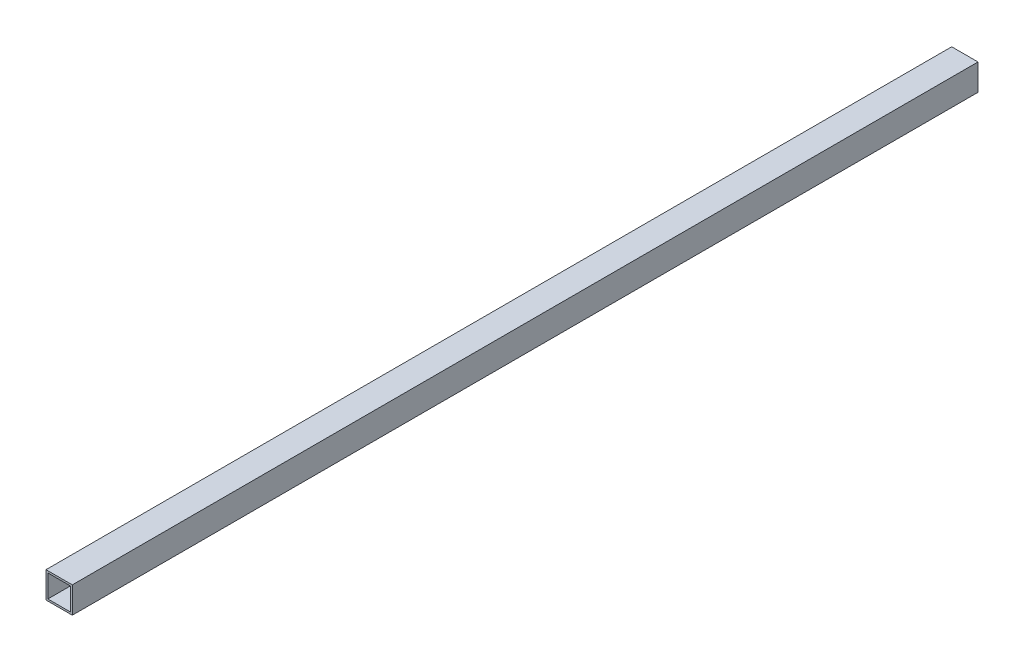
ISO-10303-21;
HEADER;
FILE_DESCRIPTION(('STEP AP214'),'2;1');
FILE_NAME('part.step','',(''),(''),'','','');
FILE_SCHEMA(('AUTOMOTIVE_DESIGN { 1 0 10303 214 1 1 1 1 }'));
ENDSEC;
DATA;
#1=APPLICATION_CONTEXT('core data for automotive mechanical design processes');
#2=APPLICATION_PROTOCOL_DEFINITION('international standard','automotive_design',2000,#1);
#3=PRODUCT_CONTEXT('',#1,'mechanical');
#4=PRODUCT('Part','Part','',(#3));
#5=PRODUCT_RELATED_PRODUCT_CATEGORY('part','',(#4));
#6=PRODUCT_DEFINITION_FORMATION('','',#4);
#7=PRODUCT_DEFINITION_CONTEXT('part definition',#1,'design');
#8=PRODUCT_DEFINITION('design','',#6,#7);
#9=PRODUCT_DEFINITION_SHAPE('','',#8);
#10=(LENGTH_UNIT() NAMED_UNIT(*) SI_UNIT(.MILLI.,.METRE.));
#11=(NAMED_UNIT(*) PLANE_ANGLE_UNIT() SI_UNIT($,.RADIAN.));
#12=(NAMED_UNIT(*) SI_UNIT($,.STERADIAN.) SOLID_ANGLE_UNIT());
#13=UNCERTAINTY_MEASURE_WITH_UNIT(LENGTH_MEASURE(1.E-05),#10,'distance_accuracy_value','');
#14=(GEOMETRIC_REPRESENTATION_CONTEXT(3) GLOBAL_UNCERTAINTY_ASSIGNED_CONTEXT((#13)) GLOBAL_UNIT_ASSIGNED_CONTEXT((#10,
#11,#12)) REPRESENTATION_CONTEXT('',''));
#15=CARTESIAN_POINT('',(0.,0.,0.));
#16=DIRECTION('',(0.,0.,1.));
#17=DIRECTION('',(1.,0.,0.));
#18=AXIS2_PLACEMENT_3D('',#15,#16,#17);
#19=CARTESIAN_POINT('',(22.2249999999999,-22.2250000000024,-1530.35));
#20=DIRECTION('',(0.999999999999998,0.,0.));
#21=DIRECTION('',(0.,0.,-1.));
#22=AXIS2_PLACEMENT_3D('',#19,#20,#21);
#23=PLANE('',#22);
#24=DIRECTION('',(0.,1.,0.));
#25=VECTOR('',#24,1.);
#26=CARTESIAN_POINT('',(22.2249999999999,-22.2249999999999,0.));
#27=LINE('',#26,#25);
#28=CARTESIAN_POINT('',(22.2249999999999,-22.2249999999999,0.));
#29=VERTEX_POINT('',#28);
#30=CARTESIAN_POINT('',(22.2249999999999,22.2250000000001,0.));
#31=VERTEX_POINT('',#30);
#32=EDGE_CURVE('E146',#29,#31,#27,.T.);
#33=ORIENTED_EDGE('',*,*,#32,.F.);
#34=DIRECTION('',(0.,0.,1.));
#35=VECTOR('',#34,1.);
#36=CARTESIAN_POINT('',(22.2249999999999,-22.2250000000024,-1530.35));
#37=LINE('',#36,#35);
#38=CARTESIAN_POINT('',(22.2249999999999,-22.2250000000024,-1530.35));
#39=VERTEX_POINT('',#38);
#40=EDGE_CURVE('E11',#39,#29,#37,.T.);
#41=ORIENTED_EDGE('',*,*,#40,.F.);
#42=DIRECTION('',(0.,1.,0.));
#43=VECTOR('',#42,1.);
#44=CARTESIAN_POINT('',(22.2249999999999,-22.2250000000024,-1530.35));
#45=LINE('',#44,#43);
#46=CARTESIAN_POINT('',(22.2249999999999,22.2249999999976,-1530.35));
#47=VERTEX_POINT('',#46);
#48=EDGE_CURVE('E152',#39,#47,#45,.T.);
#49=ORIENTED_EDGE('',*,*,#48,.T.);
#50=DIRECTION('',(0.,0.,1.));
#51=VECTOR('',#50,1.);
#52=CARTESIAN_POINT('',(22.2249999999999,22.2249999999976,-1530.35));
#53=LINE('',#52,#51);
#54=EDGE_CURVE('E39',#47,#31,#53,.T.);
#55=ORIENTED_EDGE('',*,*,#54,.T.);
#56=EDGE_LOOP('',(#33,#41,#49,#55));
#57=FACE_BOUND('',#56,.T.);
#58=ADVANCED_FACE('F36',(#57),#23,.T.);
#59=CARTESIAN_POINT('',(-22.2249999999999,-22.2250000000024,-1530.35));
#60=DIRECTION('',(0.,-1.,0.));
#61=DIRECTION('',(0.,0.,-1.));
#62=AXIS2_PLACEMENT_3D('',#59,#60,#61);
#63=PLANE('',#62);
#64=DIRECTION('',(0.999999999999998,0.,0.));
#65=VECTOR('',#64,1.);
#66=CARTESIAN_POINT('',(-22.2249999999999,-22.2249999999999,0.));
#67=LINE('',#66,#65);
#68=CARTESIAN_POINT('',(-22.2249999999999,-22.2249999999999,0.));
#69=VERTEX_POINT('',#68);
#70=EDGE_CURVE('E157',#69,#29,#67,.T.);
#71=ORIENTED_EDGE('',*,*,#70,.F.);
#72=DIRECTION('',(0.,0.,1.));
#73=VECTOR('',#72,1.);
#74=CARTESIAN_POINT('',(-22.2249999999999,-22.2250000000024,-1530.35));
#75=LINE('',#74,#73);
#76=CARTESIAN_POINT('',(-22.2249999999999,-22.2250000000024,-1530.35));
#77=VERTEX_POINT('',#76);
#78=EDGE_CURVE('E45',#77,#69,#75,.T.);
#79=ORIENTED_EDGE('',*,*,#78,.F.);
#80=DIRECTION('',(0.999999999999998,0.,0.));
#81=VECTOR('',#80,1.);
#82=CARTESIAN_POINT('',(-22.2249999999999,-22.2250000000024,-1530.35));
#83=LINE('',#82,#81);
#84=EDGE_CURVE('E165',#77,#39,#83,.T.);
#85=ORIENTED_EDGE('',*,*,#84,.T.);
#86=ORIENTED_EDGE('',*,*,#40,.T.);
#87=EDGE_LOOP('',(#71,#79,#85,#86));
#88=FACE_BOUND('',#87,.T.);
#89=ADVANCED_FACE('F201',(#88),#63,.T.);
#90=CARTESIAN_POINT('',(-22.2249999999999,-22.2250000000024,-1530.35));
#91=DIRECTION('',(-0.999999999999998,0.,0.));
#92=DIRECTION('',(0.,0.,1.));
#93=AXIS2_PLACEMENT_3D('',#90,#91,#92);
#94=PLANE('',#93);
#95=DIRECTION('',(0.,-1.,0.));
#96=VECTOR('',#95,1.);
#97=CARTESIAN_POINT('',(-22.2249999999999,-22.2249999999999,0.));
#98=LINE('',#97,#96);
#99=CARTESIAN_POINT('',(-22.2249999999999,22.2250000000001,0.));
#100=VERTEX_POINT('',#99);
#101=EDGE_CURVE('E176',#100,#69,#98,.T.);
#102=ORIENTED_EDGE('',*,*,#101,.F.);
#103=DIRECTION('',(0.,0.,1.));
#104=VECTOR('',#103,1.);
#105=CARTESIAN_POINT('',(-22.2249999999999,22.2249999999976,-1530.35));
#106=LINE('',#105,#104);
#107=CARTESIAN_POINT('',(-22.2249999999999,22.2249999999976,-1530.35));
#108=VERTEX_POINT('',#107);
#109=EDGE_CURVE('E184',#108,#100,#106,.T.);
#110=ORIENTED_EDGE('',*,*,#109,.F.);
#111=DIRECTION('',(0.,-1.,0.));
#112=VECTOR('',#111,1.);
#113=CARTESIAN_POINT('',(-22.2249999999999,-22.2250000000024,-1530.35));
#114=LINE('',#113,#112);
#115=EDGE_CURVE('E161',#108,#77,#114,.T.);
#116=ORIENTED_EDGE('',*,*,#115,.T.);
#117=ORIENTED_EDGE('',*,*,#78,.T.);
#118=EDGE_LOOP('',(#102,#110,#116,#117));
#119=FACE_BOUND('',#118,.T.);
#120=ADVANCED_FACE('F205',(#119),#94,.T.);
#121=CARTESIAN_POINT('',(-22.2249999999999,22.2249999999976,-1530.35));
#122=DIRECTION('',(0.,1.,0.));
#123=DIRECTION('',(0.,0.,1.));
#124=AXIS2_PLACEMENT_3D('',#121,#122,#123);
#125=PLANE('',#124);
#126=DIRECTION('',(-0.999999999999998,0.,0.));
#127=VECTOR('',#126,1.);
#128=CARTESIAN_POINT('',(-22.2249999999999,22.2250000000001,0.));
#129=LINE('',#128,#127);
#130=EDGE_CURVE('E172',#31,#100,#129,.T.);
#131=ORIENTED_EDGE('',*,*,#130,.F.);
#132=ORIENTED_EDGE('',*,*,#54,.F.);
#133=DIRECTION('',(-0.999999999999998,0.,0.));
#134=VECTOR('',#133,1.);
#135=CARTESIAN_POINT('',(-22.2249999999999,22.2249999999976,-1530.35));
#136=LINE('',#135,#134);
#137=EDGE_CURVE('E156',#47,#108,#136,.T.);
#138=ORIENTED_EDGE('',*,*,#137,.T.);
#139=ORIENTED_EDGE('',*,*,#109,.T.);
#140=EDGE_LOOP('',(#131,#132,#138,#139));
#141=FACE_BOUND('',#140,.T.);
#142=ADVANCED_FACE('F196',(#141),#125,.T.);
#143=CARTESIAN_POINT('',(0.,-2.44249065417534E-12,-1530.35));
#144=DIRECTION('',(0.,0.,-1.));
#145=DIRECTION('',(-0.999999999999998,0.,0.));
#146=AXIS2_PLACEMENT_3D('',#143,#144,#145);
#147=PLANE('',#146);
#148=DIRECTION('',(0.,1.,0.));
#149=VECTOR('',#148,1.);
#150=CARTESIAN_POINT('',(19.0499999999999,-19.0500000000025,-1530.35));
#151=LINE('',#150,#149);
#152=CARTESIAN_POINT('',(19.0499999999999,-19.0500000000025,-1530.35));
#153=VERTEX_POINT('',#152);
#154=CARTESIAN_POINT('',(19.0499999999999,19.0499999999976,-1530.35));
#155=VERTEX_POINT('',#154);
#156=EDGE_CURVE('E104',#153,#155,#151,.T.);
#157=ORIENTED_EDGE('',*,*,#156,.T.);
#158=DIRECTION('',(-0.999999999999998,0.,0.));
#159=VECTOR('',#158,1.);
#160=CARTESIAN_POINT('',(-19.0499999999999,19.0499999999976,-1530.35));
#161=LINE('',#160,#159);
#162=CARTESIAN_POINT('',(-19.0499999999999,19.0499999999976,-1530.35));
#163=VERTEX_POINT('',#162);
#164=EDGE_CURVE('E114',#155,#163,#161,.T.);
#165=ORIENTED_EDGE('',*,*,#164,.T.);
#166=DIRECTION('',(0.,-1.,0.));
#167=VECTOR('',#166,1.);
#168=CARTESIAN_POINT('',(-19.0499999999999,-19.0500000000025,-1530.35));
#169=LINE('',#168,#167);
#170=CARTESIAN_POINT('',(-19.0499999999999,-19.0500000000025,-1530.35));
#171=VERTEX_POINT('',#170);
#172=EDGE_CURVE('E53',#163,#171,#169,.T.);
#173=ORIENTED_EDGE('',*,*,#172,.T.);
#174=DIRECTION('',(0.999999999999998,0.,0.));
#175=VECTOR('',#174,1.);
#176=CARTESIAN_POINT('',(-19.0499999999999,-19.0500000000025,-1530.35));
#177=LINE('',#176,#175);
#178=EDGE_CURVE('E111',#171,#153,#177,.T.);
#179=ORIENTED_EDGE('',*,*,#178,.T.);
#180=EDGE_LOOP('',(#157,#165,#173,#179));
#181=FACE_BOUND('',#180,.T.);
#182=ORIENTED_EDGE('',*,*,#48,.F.);
#183=ORIENTED_EDGE('',*,*,#84,.F.);
#184=ORIENTED_EDGE('',*,*,#115,.F.);
#185=ORIENTED_EDGE('',*,*,#137,.F.);
#186=EDGE_LOOP('',(#182,#183,#184,#185));
#187=FACE_BOUND('',#186,.T.);
#188=ADVANCED_FACE('F119',(#181,#187),#147,.T.);
#189=CARTESIAN_POINT('',(0.,0.,0.));
#190=DIRECTION('',(0.,0.,-1.));
#191=DIRECTION('',(-0.999999999999998,0.,0.));
#192=AXIS2_PLACEMENT_3D('',#189,#190,#191);
#193=PLANE('',#192);
#194=DIRECTION('',(-0.999999999999998,0.,0.));
#195=VECTOR('',#194,1.);
#196=CARTESIAN_POINT('',(-19.0499999999999,19.05,0.));
#197=LINE('',#196,#195);
#198=CARTESIAN_POINT('',(19.0499999999999,19.05,0.));
#199=VERTEX_POINT('',#198);
#200=CARTESIAN_POINT('',(-19.0499999999999,19.05,0.));
#201=VERTEX_POINT('',#200);
#202=EDGE_CURVE('E137',#199,#201,#197,.T.);
#203=ORIENTED_EDGE('',*,*,#202,.F.);
#204=DIRECTION('',(0.,1.,0.));
#205=VECTOR('',#204,1.);
#206=CARTESIAN_POINT('',(19.0499999999999,-19.05,0.));
#207=LINE('',#206,#205);
#208=CARTESIAN_POINT('',(19.0499999999999,-19.05,0.));
#209=VERTEX_POINT('',#208);
#210=EDGE_CURVE('E61',#209,#199,#207,.T.);
#211=ORIENTED_EDGE('',*,*,#210,.F.);
#212=DIRECTION('',(0.999999999999998,0.,0.));
#213=VECTOR('',#212,1.);
#214=CARTESIAN_POINT('',(-19.0499999999999,-19.05,0.));
#215=LINE('',#214,#213);
#216=CARTESIAN_POINT('',(-19.0499999999999,-19.05,0.));
#217=VERTEX_POINT('',#216);
#218=EDGE_CURVE('E123',#217,#209,#215,.T.);
#219=ORIENTED_EDGE('',*,*,#218,.F.);
#220=DIRECTION('',(0.,-1.,0.));
#221=VECTOR('',#220,1.);
#222=CARTESIAN_POINT('',(-19.0499999999999,-19.05,0.));
#223=LINE('',#222,#221);
#224=EDGE_CURVE('E128',#201,#217,#223,.T.);
#225=ORIENTED_EDGE('',*,*,#224,.F.);
#226=EDGE_LOOP('',(#203,#211,#219,#225));
#227=FACE_BOUND('',#226,.T.);
#228=ORIENTED_EDGE('',*,*,#32,.T.);
#229=ORIENTED_EDGE('',*,*,#130,.T.);
#230=ORIENTED_EDGE('',*,*,#101,.T.);
#231=ORIENTED_EDGE('',*,*,#70,.T.);
#232=EDGE_LOOP('',(#228,#229,#230,#231));
#233=FACE_BOUND('',#232,.T.);
#234=ADVANCED_FACE('F198',(#227,#233),#193,.F.);
#235=CARTESIAN_POINT('',(19.0499999999999,-19.0500000000025,-1530.35));
#236=DIRECTION('',(0.999999999999998,0.,0.));
#237=DIRECTION('',(0.,0.,-1.));
#238=AXIS2_PLACEMENT_3D('',#235,#236,#237);
#239=PLANE('',#238);
#240=ORIENTED_EDGE('',*,*,#210,.T.);
#241=DIRECTION('',(0.,0.,1.));
#242=VECTOR('',#241,1.);
#243=CARTESIAN_POINT('',(19.0499999999999,19.0499999999976,-1530.35));
#244=LINE('',#243,#242);
#245=EDGE_CURVE('E100',#155,#199,#244,.T.);
#246=ORIENTED_EDGE('',*,*,#245,.F.);
#247=ORIENTED_EDGE('',*,*,#156,.F.);
#248=DIRECTION('',(0.,0.,1.));
#249=VECTOR('',#248,1.);
#250=CARTESIAN_POINT('',(19.0499999999999,-19.0500000000025,-1530.35));
#251=LINE('',#250,#249);
#252=EDGE_CURVE('E143',#153,#209,#251,.T.);
#253=ORIENTED_EDGE('',*,*,#252,.T.);
#254=EDGE_LOOP('',(#240,#246,#247,#253));
#255=FACE_BOUND('',#254,.T.);
#256=ADVANCED_FACE('F102',(#255),#239,.F.);
#257=CARTESIAN_POINT('',(-19.0499999999999,-19.0500000000025,-1530.35));
#258=DIRECTION('',(0.,-1.,0.));
#259=DIRECTION('',(0.,0.,-1.));
#260=AXIS2_PLACEMENT_3D('',#257,#258,#259);
#261=PLANE('',#260);
#262=ORIENTED_EDGE('',*,*,#218,.T.);
#263=ORIENTED_EDGE('',*,*,#252,.F.);
#264=ORIENTED_EDGE('',*,*,#178,.F.);
#265=DIRECTION('',(0.,0.,1.));
#266=VECTOR('',#265,1.);
#267=CARTESIAN_POINT('',(-19.0499999999999,-19.0500000000025,-1530.35));
#268=LINE('',#267,#266);
#269=EDGE_CURVE('E147',#171,#217,#268,.T.);
#270=ORIENTED_EDGE('',*,*,#269,.T.);
#271=EDGE_LOOP('',(#262,#263,#264,#270));
#272=FACE_BOUND('',#271,.T.);
#273=ADVANCED_FACE('F256',(#272),#261,.F.);
#274=CARTESIAN_POINT('',(-19.0499999999999,-19.0500000000025,-1530.35));
#275=DIRECTION('',(-0.999999999999998,0.,0.));
#276=DIRECTION('',(0.,0.,1.));
#277=AXIS2_PLACEMENT_3D('',#274,#275,#276);
#278=PLANE('',#277);
#279=ORIENTED_EDGE('',*,*,#224,.T.);
#280=ORIENTED_EDGE('',*,*,#269,.F.);
#281=ORIENTED_EDGE('',*,*,#172,.F.);
#282=DIRECTION('',(0.,0.,1.));
#283=VECTOR('',#282,1.);
#284=CARTESIAN_POINT('',(-19.0499999999999,19.0499999999976,-1530.35));
#285=LINE('',#284,#283);
#286=EDGE_CURVE('E110',#163,#201,#285,.T.);
#287=ORIENTED_EDGE('',*,*,#286,.T.);
#288=EDGE_LOOP('',(#279,#280,#281,#287));
#289=FACE_BOUND('',#288,.T.);
#290=ADVANCED_FACE('F265',(#289),#278,.F.);
#291=CARTESIAN_POINT('',(-19.0499999999999,19.0499999999976,-1530.35));
#292=DIRECTION('',(0.,1.,0.));
#293=DIRECTION('',(0.,0.,1.));
#294=AXIS2_PLACEMENT_3D('',#291,#292,#293);
#295=PLANE('',#294);
#296=ORIENTED_EDGE('',*,*,#202,.T.);
#297=ORIENTED_EDGE('',*,*,#286,.F.);
#298=ORIENTED_EDGE('',*,*,#164,.F.);
#299=ORIENTED_EDGE('',*,*,#245,.T.);
#300=EDGE_LOOP('',(#296,#297,#298,#299));
#301=FACE_BOUND('',#300,.T.);
#302=ADVANCED_FACE('F115',(#301),#295,.F.);
#303=CLOSED_SHELL('',(#58,#89,#120,#142,#188,#234,#256,#273,#290,#302));
#304=MANIFOLD_SOLID_BREP('B2',#303);
#305=ADVANCED_BREP_SHAPE_REPRESENTATION('',(#18,#304),#14);
#306=SHAPE_DEFINITION_REPRESENTATION(#9,#305);
ENDSEC;
END-ISO-10303-21;
